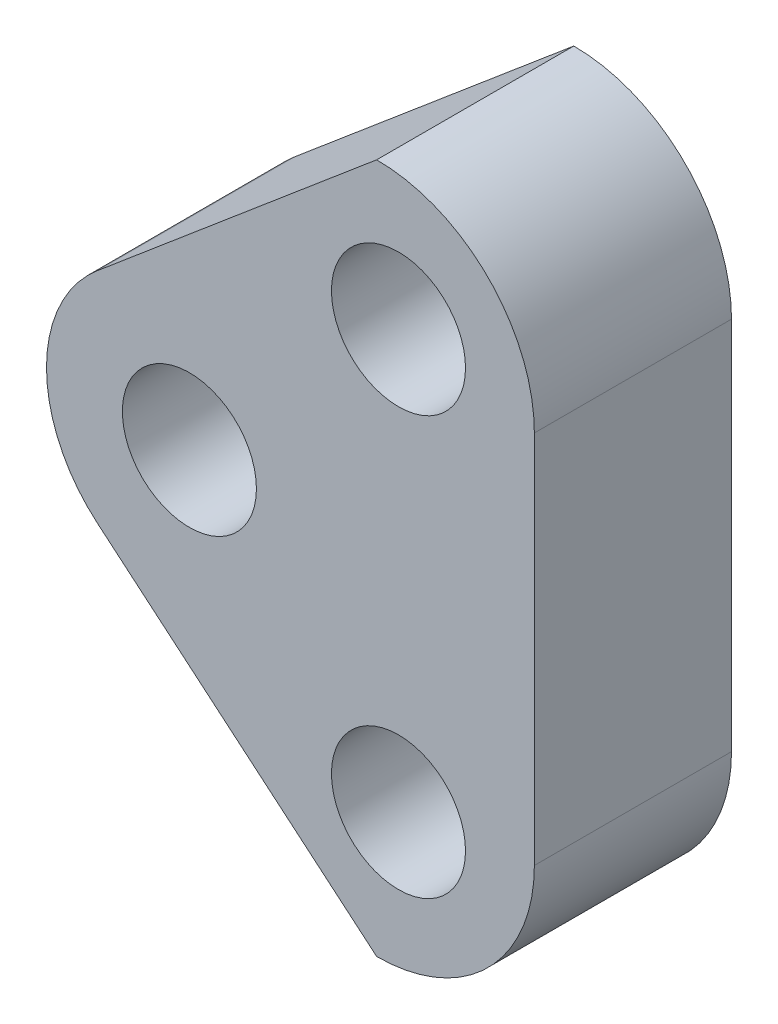
ISO-10303-21;
HEADER;
FILE_DESCRIPTION(('STEP AP214'),'2;1');
FILE_NAME('part.step','',(''),(''),'','','');
FILE_SCHEMA(('AUTOMOTIVE_DESIGN { 1 0 10303 214 1 1 1 1 }'));
ENDSEC;
DATA;
#1=APPLICATION_CONTEXT('core data for automotive mechanical design processes');
#2=APPLICATION_PROTOCOL_DEFINITION('international standard','automotive_design',2000,#1);
#3=PRODUCT_CONTEXT('',#1,'mechanical');
#4=PRODUCT('Part','Part','',(#3));
#5=PRODUCT_RELATED_PRODUCT_CATEGORY('part','',(#4));
#6=PRODUCT_DEFINITION_FORMATION('','',#4);
#7=PRODUCT_DEFINITION_CONTEXT('part definition',#1,'design');
#8=PRODUCT_DEFINITION('design','',#6,#7);
#9=PRODUCT_DEFINITION_SHAPE('','',#8);
#10=(LENGTH_UNIT() NAMED_UNIT(*) SI_UNIT(.MILLI.,.METRE.));
#11=(NAMED_UNIT(*) PLANE_ANGLE_UNIT() SI_UNIT($,.RADIAN.));
#12=(NAMED_UNIT(*) SI_UNIT($,.STERADIAN.) SOLID_ANGLE_UNIT());
#13=UNCERTAINTY_MEASURE_WITH_UNIT(LENGTH_MEASURE(1.E-05),#10,'distance_accuracy_value','');
#14=(GEOMETRIC_REPRESENTATION_CONTEXT(3) GLOBAL_UNCERTAINTY_ASSIGNED_CONTEXT((#13)) GLOBAL_UNIT_ASSIGNED_CONTEXT((#10,
#11,#12)) REPRESENTATION_CONTEXT('',''));
#15=CARTESIAN_POINT('',(0.,0.,0.));
#16=DIRECTION('',(0.,0.,1.));
#17=DIRECTION('',(1.,0.,0.));
#18=AXIS2_PLACEMENT_3D('',#15,#16,#17);
#19=CARTESIAN_POINT('',(9.5,9.5,11.));
#20=DIRECTION('',(0.,0.,1.));
#21=DIRECTION('',(1.,0.,0.));
#22=AXIS2_PLACEMENT_3D('',#19,#20,#21);
#23=PLANE('',#22);
#24=CARTESIAN_POINT('',(10.6066017177982,10.6066017177982,11.));
#25=DIRECTION('',(0.,0.,1.));
#26=DIRECTION('',(1.,0.,0.));
#27=AXIS2_PLACEMENT_3D('',#24,#25,#26);
#28=CIRCLE('',#27,3.4);
#29=CARTESIAN_POINT('',(14.0066017177982,10.6066017177982,11.));
#30=VERTEX_POINT('',#29);
#31=EDGE_CURVE('E164',#30,#30,#28,.T.);
#32=ORIENTED_EDGE('',*,*,#31,.F.);
#33=EDGE_LOOP('',(#32));
#34=FACE_BOUND('',#33,.T.);
#35=CARTESIAN_POINT('',(10.6066017177982,-10.6066017177982,11.));
#36=DIRECTION('',(0.,0.,1.));
#37=DIRECTION('',(1.,0.,0.));
#38=AXIS2_PLACEMENT_3D('',#35,#36,#37);
#39=CIRCLE('',#38,3.4);
#40=CARTESIAN_POINT('',(14.0066017177982,-10.6066017177982,11.));
#41=VERTEX_POINT('',#40);
#42=EDGE_CURVE('E77',#41,#41,#39,.T.);
#43=ORIENTED_EDGE('',*,*,#42,.F.);
#44=EDGE_LOOP('',(#43));
#45=FACE_BOUND('',#44,.T.);
#46=CARTESIAN_POINT('',(0.,0.,11.));
#47=DIRECTION('',(0.,0.,1.));
#48=DIRECTION('',(1.,0.,0.));
#49=AXIS2_PLACEMENT_3D('',#46,#47,#48);
#50=CIRCLE('',#49,3.4);
#51=CARTESIAN_POINT('',(3.4,0.,11.));
#52=VERTEX_POINT('',#51);
#53=EDGE_CURVE('E167',#52,#52,#50,.F.);
#54=ORIENTED_EDGE('',*,*,#53,.T.);
#55=EDGE_LOOP('',(#54));
#56=FACE_BOUND('',#55,.T.);
#57=CARTESIAN_POINT('',(0.,0.,11.));
#58=DIRECTION('',(0.,0.,-1.));
#59=DIRECTION('',(-1.,0.,0.));
#60=AXIS2_PLACEMENT_3D('',#57,#58,#59);
#61=CIRCLE('',#60,7.24873734152916);
#62=CARTESIAN_POINT('',(-4.67452685224013,-5.54012560815774,11.));
#63=VERTEX_POINT('',#62);
#64=CARTESIAN_POINT('',(-4.67452685224014,5.54012560815775,11.));
#65=VERTEX_POINT('',#64);
#66=EDGE_CURVE('E125',#63,#65,#61,.T.);
#67=ORIENTED_EDGE('',*,*,#66,.F.);
#68=DIRECTION('',(-0.764288364597995,0.644874635677449,0.));
#69=VECTOR('',#68,1.);
#70=CARTESIAN_POINT('',(-4.67452685224013,-5.54012560815774,11.));
#71=LINE('',#70,#69);
#72=CARTESIAN_POINT('',(9.5,-17.5,11.));
#73=VERTEX_POINT('',#72);
#74=EDGE_CURVE('E127',#73,#63,#71,.T.);
#75=ORIENTED_EDGE('',*,*,#74,.F.);
#76=CARTESIAN_POINT('',(9.5,-9.50000000000001,11.));
#77=DIRECTION('',(0.,0.,1.));
#78=DIRECTION('',(1.,0.,0.));
#79=AXIS2_PLACEMENT_3D('',#76,#77,#78);
#80=CIRCLE('',#79,8.);
#81=CARTESIAN_POINT('',(17.5,-9.50000000000001,11.));
#82=VERTEX_POINT('',#81);
#83=EDGE_CURVE('E94',#73,#82,#80,.T.);
#84=ORIENTED_EDGE('',*,*,#83,.T.);
#85=DIRECTION('',(0.,1.,0.));
#86=VECTOR('',#85,1.);
#87=CARTESIAN_POINT('',(17.5,-9.50000000000001,11.));
#88=LINE('',#87,#86);
#89=CARTESIAN_POINT('',(17.5,9.5,11.));
#90=VERTEX_POINT('',#89);
#91=EDGE_CURVE('E89',#82,#90,#88,.T.);
#92=ORIENTED_EDGE('',*,*,#91,.T.);
#93=CARTESIAN_POINT('',(9.5,9.5,11.));
#94=DIRECTION('',(0.,0.,1.));
#95=DIRECTION('',(1.,0.,0.));
#96=AXIS2_PLACEMENT_3D('',#93,#94,#95);
#97=CIRCLE('',#96,8.);
#98=CARTESIAN_POINT('',(9.5,17.5,11.));
#99=VERTEX_POINT('',#98);
#100=EDGE_CURVE('E160',#90,#99,#97,.T.);
#101=ORIENTED_EDGE('',*,*,#100,.T.);
#102=DIRECTION('',(-0.764288364597996,-0.644874635677448,0.));
#103=VECTOR('',#102,1.);
#104=CARTESIAN_POINT('',(-4.67452685224014,5.54012560815775,11.));
#105=LINE('',#104,#103);
#106=EDGE_CURVE('E128',#99,#65,#105,.T.);
#107=ORIENTED_EDGE('',*,*,#106,.T.);
#108=EDGE_LOOP('',(#67,#75,#84,#92,#101,#107));
#109=FACE_BOUND('',#108,.T.);
#110=ADVANCED_FACE('F73',(#34,#45,#56,#109),#23,.T.);
#111=CARTESIAN_POINT('',(17.5,0.,1.));
#112=DIRECTION('',(0.,0.,-1.));
#113=DIRECTION('',(-1.,0.,0.));
#114=AXIS2_PLACEMENT_3D('',#111,#112,#113);
#115=PLANE('',#114);
#116=DIRECTION('',(-0.764288364597995,0.644874635677449,0.));
#117=VECTOR('',#116,1.);
#118=CARTESIAN_POINT('',(-4.67452685224013,-5.54012560815774,1.));
#119=LINE('',#118,#117);
#120=CARTESIAN_POINT('',(9.5,-17.5,1.));
#121=VERTEX_POINT('',#120);
#122=CARTESIAN_POINT('',(-4.67452685224013,-5.54012560815774,1.));
#123=VERTEX_POINT('',#122);
#124=EDGE_CURVE('E139',#121,#123,#119,.T.);
#125=ORIENTED_EDGE('',*,*,#124,.T.);
#126=CARTESIAN_POINT('',(0.,0.,1.));
#127=DIRECTION('',(0.,0.,-1.));
#128=DIRECTION('',(-1.,0.,0.));
#129=AXIS2_PLACEMENT_3D('',#126,#127,#128);
#130=CIRCLE('',#129,7.24873734152916);
#131=CARTESIAN_POINT('',(-4.67452685224014,5.54012560815775,1.));
#132=VERTEX_POINT('',#131);
#133=EDGE_CURVE('E143',#123,#132,#130,.T.);
#134=ORIENTED_EDGE('',*,*,#133,.T.);
#135=DIRECTION('',(-0.764288364597996,-0.644874635677448,0.));
#136=VECTOR('',#135,1.);
#137=CARTESIAN_POINT('',(-4.67452685224014,5.54012560815775,1.));
#138=LINE('',#137,#136);
#139=CARTESIAN_POINT('',(9.5,17.5,1.));
#140=VERTEX_POINT('',#139);
#141=EDGE_CURVE('E132',#140,#132,#138,.T.);
#142=ORIENTED_EDGE('',*,*,#141,.F.);
#143=CARTESIAN_POINT('',(9.5,9.5,1.));
#144=DIRECTION('',(0.,0.,-1.));
#145=DIRECTION('',(-1.,0.,0.));
#146=AXIS2_PLACEMENT_3D('',#143,#144,#145);
#147=CIRCLE('',#146,8.);
#148=CARTESIAN_POINT('',(17.5,9.5,1.));
#149=VERTEX_POINT('',#148);
#150=EDGE_CURVE('E153',#140,#149,#147,.T.);
#151=ORIENTED_EDGE('',*,*,#150,.T.);
#152=DIRECTION('',(0.,-1.,0.));
#153=VECTOR('',#152,1.);
#154=CARTESIAN_POINT('',(17.5,9.5,1.));
#155=LINE('',#154,#153);
#156=CARTESIAN_POINT('',(17.5,-9.5,1.));
#157=VERTEX_POINT('',#156);
#158=EDGE_CURVE('E155',#149,#157,#155,.T.);
#159=ORIENTED_EDGE('',*,*,#158,.T.);
#160=CARTESIAN_POINT('',(9.5,-9.50000000000001,1.));
#161=DIRECTION('',(0.,0.,-1.));
#162=DIRECTION('',(-1.,0.,0.));
#163=AXIS2_PLACEMENT_3D('',#160,#161,#162);
#164=CIRCLE('',#163,8.);
#165=EDGE_CURVE('E157',#157,#121,#164,.T.);
#166=ORIENTED_EDGE('',*,*,#165,.T.);
#167=EDGE_LOOP('',(#125,#134,#142,#151,#159,#166));
#168=FACE_BOUND('',#167,.T.);
#169=CARTESIAN_POINT('',(0.,0.,1.));
#170=DIRECTION('',(0.,0.,-1.));
#171=DIRECTION('',(-1.,0.,0.));
#172=AXIS2_PLACEMENT_3D('',#169,#170,#171);
#173=CIRCLE('',#172,3.25);
#174=CARTESIAN_POINT('',(-3.25,0.,1.));
#175=VERTEX_POINT('',#174);
#176=EDGE_CURVE('E396',#175,#175,#173,.T.);
#177=ORIENTED_EDGE('',*,*,#176,.F.);
#178=EDGE_LOOP('',(#177));
#179=FACE_BOUND('',#178,.T.);
#180=ADVANCED_FACE('F191',(#168,#179),#115,.T.);
#181=CARTESIAN_POINT('',(9.5,-9.50000000000001,11.));
#182=DIRECTION('',(0.,0.,-1.));
#183=DIRECTION('',(-1.,0.,0.));
#184=AXIS2_PLACEMENT_3D('',#181,#182,#183);
#185=CYLINDRICAL_SURFACE('',#184,8.);
#186=ORIENTED_EDGE('',*,*,#165,.F.);
#187=DIRECTION('',(0.,0.,-1.));
#188=VECTOR('',#187,1.);
#189=CARTESIAN_POINT('',(17.5,-9.50000000000001,11.));
#190=LINE('',#189,#188);
#191=EDGE_CURVE('E82',#82,#157,#190,.T.);
#192=ORIENTED_EDGE('',*,*,#191,.F.);
#193=ORIENTED_EDGE('',*,*,#83,.F.);
#194=DIRECTION('',(0.,0.,-1.));
#195=VECTOR('',#194,1.);
#196=CARTESIAN_POINT('',(9.5,-17.5,11.));
#197=LINE('',#196,#195);
#198=EDGE_CURVE('E12',#73,#121,#197,.T.);
#199=ORIENTED_EDGE('',*,*,#198,.T.);
#200=EDGE_LOOP('',(#186,#192,#193,#199));
#201=FACE_BOUND('',#200,.T.);
#202=ADVANCED_FACE('F189',(#201),#185,.T.);
#203=CARTESIAN_POINT('',(17.5,0.,11.));
#204=DIRECTION('',(-1.,0.,0.));
#205=DIRECTION('',(0.,0.,1.));
#206=AXIS2_PLACEMENT_3D('',#203,#204,#205);
#207=PLANE('',#206);
#208=ORIENTED_EDGE('',*,*,#158,.F.);
#209=DIRECTION('',(0.,0.,-1.));
#210=VECTOR('',#209,1.);
#211=CARTESIAN_POINT('',(17.5,9.5,11.));
#212=LINE('',#211,#210);
#213=EDGE_CURVE('E178',#90,#149,#212,.T.);
#214=ORIENTED_EDGE('',*,*,#213,.F.);
#215=ORIENTED_EDGE('',*,*,#91,.F.);
#216=ORIENTED_EDGE('',*,*,#191,.T.);
#217=EDGE_LOOP('',(#208,#214,#215,#216));
#218=FACE_BOUND('',#217,.T.);
#219=ADVANCED_FACE('F185',(#218),#207,.F.);
#220=CARTESIAN_POINT('',(9.5,9.5,11.));
#221=DIRECTION('',(0.,0.,-1.));
#222=DIRECTION('',(-1.,0.,0.));
#223=AXIS2_PLACEMENT_3D('',#220,#221,#222);
#224=CYLINDRICAL_SURFACE('',#223,8.);
#225=ORIENTED_EDGE('',*,*,#150,.F.);
#226=DIRECTION('',(0.,0.,-1.));
#227=VECTOR('',#226,1.);
#228=CARTESIAN_POINT('',(9.5,17.5,11.));
#229=LINE('',#228,#227);
#230=EDGE_CURVE('E176',#99,#140,#229,.T.);
#231=ORIENTED_EDGE('',*,*,#230,.F.);
#232=ORIENTED_EDGE('',*,*,#100,.F.);
#233=ORIENTED_EDGE('',*,*,#213,.T.);
#234=EDGE_LOOP('',(#225,#231,#232,#233));
#235=FACE_BOUND('',#234,.T.);
#236=ADVANCED_FACE('F197',(#235),#224,.T.);
#237=CARTESIAN_POINT('',(0.,0.,0.));
#238=DIRECTION('',(0.,0.,1.));
#239=DIRECTION('',(1.,0.,0.));
#240=AXIS2_PLACEMENT_3D('',#237,#238,#239);
#241=CYLINDRICAL_SURFACE('',#240,3.4);
#242=CARTESIAN_POINT('',(0.,0.,5.));
#243=DIRECTION('',(0.,0.,-1.));
#244=DIRECTION('',(-1.,0.,0.));
#245=AXIS2_PLACEMENT_3D('',#242,#243,#244);
#246=CIRCLE('',#245,3.4);
#247=CARTESIAN_POINT('',(-3.4,0.,5.));
#248=VERTEX_POINT('',#247);
#249=EDGE_CURVE('E398',#248,#248,#246,.F.);
#250=ORIENTED_EDGE('',*,*,#249,.F.);
#251=EDGE_LOOP('',(#250));
#252=FACE_BOUND('',#251,.T.);
#253=ORIENTED_EDGE('',*,*,#53,.F.);
#254=EDGE_LOOP('',(#253));
#255=FACE_BOUND('',#254,.T.);
#256=ADVANCED_FACE('F221',(#252,#255),#241,.F.);
#257=CARTESIAN_POINT('',(10.6066017177982,10.6066017177982,3.));
#258=DIRECTION('',(0.,0.,-1.));
#259=DIRECTION('',(-1.,0.,0.));
#260=AXIS2_PLACEMENT_3D('',#257,#258,#259);
#261=PLANE('',#260);
#262=CARTESIAN_POINT('',(10.6066017177982,10.6066017177982,3.));
#263=DIRECTION('',(0.,0.,-1.));
#264=DIRECTION('',(-1.,0.,0.));
#265=AXIS2_PLACEMENT_3D('',#262,#263,#264);
#266=CIRCLE('',#265,3.4);
#267=CARTESIAN_POINT('',(7.20660171779821,10.6066017177982,3.));
#268=VERTEX_POINT('',#267);
#269=EDGE_CURVE('E170',#268,#268,#266,.T.);
#270=ORIENTED_EDGE('',*,*,#269,.F.);
#271=EDGE_LOOP('',(#270));
#272=FACE_BOUND('',#271,.T.);
#273=ADVANCED_FACE('F224',(#272),#261,.F.);
#274=CARTESIAN_POINT('',(10.6066017177982,10.6066017177982,11.));
#275=DIRECTION('',(0.,0.,-1.));
#276=DIRECTION('',(-1.,0.,0.));
#277=AXIS2_PLACEMENT_3D('',#274,#275,#276);
#278=CYLINDRICAL_SURFACE('',#277,3.4);
#279=ORIENTED_EDGE('',*,*,#269,.T.);
#280=EDGE_LOOP('',(#279));
#281=FACE_BOUND('',#280,.T.);
#282=ORIENTED_EDGE('',*,*,#31,.T.);
#283=EDGE_LOOP('',(#282));
#284=FACE_BOUND('',#283,.T.);
#285=ADVANCED_FACE('F228',(#281,#284),#278,.F.);
#286=CARTESIAN_POINT('',(10.6066017177982,-10.6066017177982,3.));
#287=DIRECTION('',(0.,0.,-1.));
#288=DIRECTION('',(-1.,0.,0.));
#289=AXIS2_PLACEMENT_3D('',#286,#287,#288);
#290=PLANE('',#289);
#291=CARTESIAN_POINT('',(10.6066017177982,-10.6066017177982,3.));
#292=DIRECTION('',(0.,0.,-1.));
#293=DIRECTION('',(-1.,0.,0.));
#294=AXIS2_PLACEMENT_3D('',#291,#292,#293);
#295=CIRCLE('',#294,3.4);
#296=CARTESIAN_POINT('',(7.20660171779821,-10.6066017177982,3.));
#297=VERTEX_POINT('',#296);
#298=EDGE_CURVE('E173',#297,#297,#295,.T.);
#299=ORIENTED_EDGE('',*,*,#298,.F.);
#300=EDGE_LOOP('',(#299));
#301=FACE_BOUND('',#300,.T.);
#302=ADVANCED_FACE('F230',(#301),#290,.F.);
#303=CARTESIAN_POINT('',(10.6066017177982,-10.6066017177982,11.));
#304=DIRECTION('',(0.,0.,-1.));
#305=DIRECTION('',(-1.,0.,0.));
#306=AXIS2_PLACEMENT_3D('',#303,#304,#305);
#307=CYLINDRICAL_SURFACE('',#306,3.4);
#308=ORIENTED_EDGE('',*,*,#298,.T.);
#309=EDGE_LOOP('',(#308));
#310=FACE_BOUND('',#309,.T.);
#311=ORIENTED_EDGE('',*,*,#42,.T.);
#312=EDGE_LOOP('',(#311));
#313=FACE_BOUND('',#312,.T.);
#314=ADVANCED_FACE('F75',(#310,#313),#307,.F.);
#315=CARTESIAN_POINT('',(0.,0.,11.));
#316=DIRECTION('',(0.,0.,-1.));
#317=DIRECTION('',(-1.,0.,0.));
#318=AXIS2_PLACEMENT_3D('',#315,#316,#317);
#319=CYLINDRICAL_SURFACE('',#318,7.24873734152916);
#320=ORIENTED_EDGE('',*,*,#133,.F.);
#321=DIRECTION('',(0.,0.,-1.));
#322=VECTOR('',#321,1.);
#323=CARTESIAN_POINT('',(-4.67452685224013,-5.54012560815774,11.));
#324=LINE('',#323,#322);
#325=EDGE_CURVE('E137',#63,#123,#324,.T.);
#326=ORIENTED_EDGE('',*,*,#325,.F.);
#327=ORIENTED_EDGE('',*,*,#66,.T.);
#328=DIRECTION('',(0.,0.,-1.));
#329=VECTOR('',#328,1.);
#330=CARTESIAN_POINT('',(-4.67452685224014,5.54012560815775,11.));
#331=LINE('',#330,#329);
#332=EDGE_CURVE('E148',#65,#132,#331,.T.);
#333=ORIENTED_EDGE('',*,*,#332,.T.);
#334=EDGE_LOOP('',(#320,#326,#327,#333));
#335=FACE_BOUND('',#334,.T.);
#336=ADVANCED_FACE('F141',(#335),#319,.T.);
#337=CARTESIAN_POINT('',(-4.67452685224014,5.54012560815775,11.));
#338=DIRECTION('',(0.644874635677448,-0.764288364597996,0.));
#339=DIRECTION('',(0.764288364597996,0.644874635677448,0.));
#340=AXIS2_PLACEMENT_3D('',#337,#338,#339);
#341=PLANE('',#340);
#342=ORIENTED_EDGE('',*,*,#141,.T.);
#343=ORIENTED_EDGE('',*,*,#332,.F.);
#344=ORIENTED_EDGE('',*,*,#106,.F.);
#345=ORIENTED_EDGE('',*,*,#230,.T.);
#346=EDGE_LOOP('',(#342,#343,#344,#345));
#347=FACE_BOUND('',#346,.T.);
#348=ADVANCED_FACE('F199',(#347),#341,.F.);
#349=CARTESIAN_POINT('',(-4.67452685224013,-5.54012560815774,11.));
#350=DIRECTION('',(-0.644874635677449,-0.764288364597995,0.));
#351=DIRECTION('',(0.764288364597995,-0.644874635677449,0.));
#352=AXIS2_PLACEMENT_3D('',#349,#350,#351);
#353=PLANE('',#352);
#354=ORIENTED_EDGE('',*,*,#124,.F.);
#355=ORIENTED_EDGE('',*,*,#198,.F.);
#356=ORIENTED_EDGE('',*,*,#74,.T.);
#357=ORIENTED_EDGE('',*,*,#325,.T.);
#358=EDGE_LOOP('',(#354,#355,#356,#357));
#359=FACE_BOUND('',#358,.T.);
#360=ADVANCED_FACE('F136',(#359),#353,.T.);
#361=CARTESIAN_POINT('',(0.,0.,5.));
#362=DIRECTION('',(0.,0.,-1.));
#363=DIRECTION('',(-1.,0.,0.));
#364=AXIS2_PLACEMENT_3D('',#361,#362,#363);
#365=PLANE('',#364);
#366=CARTESIAN_POINT('',(0.,0.,5.));
#367=DIRECTION('',(0.,0.,-1.));
#368=DIRECTION('',(-1.,0.,0.));
#369=AXIS2_PLACEMENT_3D('',#366,#367,#368);
#370=CIRCLE('',#369,3.25);
#371=CARTESIAN_POINT('',(-3.25,0.,5.));
#372=VERTEX_POINT('',#371);
#373=EDGE_CURVE('E393',#372,#372,#370,.T.);
#374=ORIENTED_EDGE('',*,*,#373,.T.);
#375=EDGE_LOOP('',(#374));
#376=FACE_BOUND('',#375,.T.);
#377=ORIENTED_EDGE('',*,*,#249,.T.);
#378=EDGE_LOOP('',(#377));
#379=FACE_BOUND('',#378,.T.);
#380=ADVANCED_FACE('F206',(#376,#379),#365,.F.);
#381=CARTESIAN_POINT('',(0.,0.,5.));
#382=DIRECTION('',(0.,0.,-1.));
#383=DIRECTION('',(-1.,0.,0.));
#384=AXIS2_PLACEMENT_3D('',#381,#382,#383);
#385=CYLINDRICAL_SURFACE('',#384,3.25);
#386=ORIENTED_EDGE('',*,*,#373,.F.);
#387=EDGE_LOOP('',(#386));
#388=FACE_BOUND('',#387,.T.);
#389=ORIENTED_EDGE('',*,*,#176,.T.);
#390=EDGE_LOOP('',(#389));
#391=FACE_BOUND('',#390,.T.);
#392=ADVANCED_FACE('F307',(#388,#391),#385,.F.);
#393=CLOSED_SHELL('',(#110,#180,#202,#219,#236,#256,#273,#285,#302,#314,#336,#348,#360,#380,#392));
#394=MANIFOLD_SOLID_BREP('B2',#393);
#395=ADVANCED_BREP_SHAPE_REPRESENTATION('',(#18,#394),#14);
#396=SHAPE_DEFINITION_REPRESENTATION(#9,#395);
ENDSEC;
END-ISO-10303-21;
